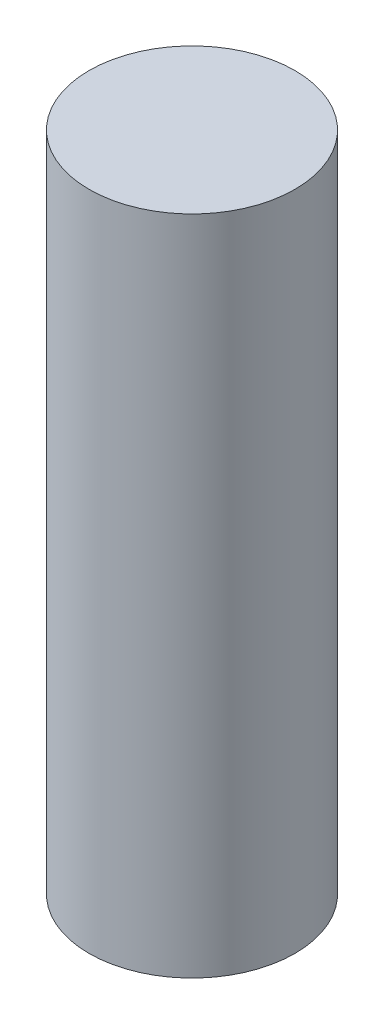
ISO-10303-21;
HEADER;
FILE_DESCRIPTION(('STEP AP214'),'2;1');
FILE_NAME('part.step','',(''),(''),'','','');
FILE_SCHEMA(('AUTOMOTIVE_DESIGN { 1 0 10303 214 1 1 1 1 }'));
ENDSEC;
DATA;
#1=APPLICATION_CONTEXT('core data for automotive mechanical design processes');
#2=APPLICATION_PROTOCOL_DEFINITION('international standard','automotive_design',2000,#1);
#3=PRODUCT_CONTEXT('',#1,'mechanical');
#4=PRODUCT('Part','Part','',(#3));
#5=PRODUCT_RELATED_PRODUCT_CATEGORY('part','',(#4));
#6=PRODUCT_DEFINITION_FORMATION('','',#4);
#7=PRODUCT_DEFINITION_CONTEXT('part definition',#1,'design');
#8=PRODUCT_DEFINITION('design','',#6,#7);
#9=PRODUCT_DEFINITION_SHAPE('','',#8);
#10=(LENGTH_UNIT() NAMED_UNIT(*) SI_UNIT(.MILLI.,.METRE.));
#11=(NAMED_UNIT(*) PLANE_ANGLE_UNIT() SI_UNIT($,.RADIAN.));
#12=(NAMED_UNIT(*) SI_UNIT($,.STERADIAN.) SOLID_ANGLE_UNIT());
#13=UNCERTAINTY_MEASURE_WITH_UNIT(LENGTH_MEASURE(1.E-05),#10,'distance_accuracy_value','');
#14=(GEOMETRIC_REPRESENTATION_CONTEXT(3) GLOBAL_UNCERTAINTY_ASSIGNED_CONTEXT((#13)) GLOBAL_UNIT_ASSIGNED_CONTEXT((#10,
#11,#12)) REPRESENTATION_CONTEXT('',''));
#15=CARTESIAN_POINT('',(0.,0.,0.));
#16=DIRECTION('',(0.,0.,1.));
#17=DIRECTION('',(1.,0.,0.));
#18=AXIS2_PLACEMENT_3D('',#15,#16,#17);
#19=CARTESIAN_POINT('',(0.,45.,0.));
#20=DIRECTION('',(0.,-1.,0.));
#21=DIRECTION('',(0.,0.,-1.));
#22=AXIS2_PLACEMENT_3D('',#19,#20,#21);
#23=CYLINDRICAL_SURFACE('',#22,7.);
#24=CARTESIAN_POINT('',(0.,45.,0.));
#25=DIRECTION('',(0.,1.,0.));
#26=DIRECTION('',(0.,0.,1.));
#27=AXIS2_PLACEMENT_3D('',#24,#25,#26);
#28=CIRCLE('',#27,7.);
#29=CARTESIAN_POINT('',(0.,45.,-7.));
#30=VERTEX_POINT('',#29);
#31=EDGE_CURVE('E10',#30,#30,#28,.T.);
#32=CARTESIAN_POINT('',(0.,0.,0.));
#33=DIRECTION('',(0.,1.,0.));
#34=DIRECTION('',(0.,0.,1.));
#35=AXIS2_PLACEMENT_3D('',#32,#33,#34);
#36=CIRCLE('',#35,7.);
#37=CARTESIAN_POINT('',(0.,0.,-7.));
#38=VERTEX_POINT('',#37);
#39=EDGE_CURVE('E36',#38,#38,#36,.T.);
#40=CARTESIAN_POINT('',(0.,45.,-7.));
#41=CARTESIAN_POINT('',(0.,44.53125,-7.));
#42=CARTESIAN_POINT('',(0.,44.0625,-7.));
#43=CARTESIAN_POINT('',(0.,43.125,-7.));
#44=CARTESIAN_POINT('',(0.,42.65625,-7.));
#45=CARTESIAN_POINT('',(0.,41.71875,-7.));
#46=CARTESIAN_POINT('',(0.,41.25,-7.));
#47=CARTESIAN_POINT('',(0.,40.3125,-7.));
#48=CARTESIAN_POINT('',(0.,39.84375,-7.));
#49=CARTESIAN_POINT('',(0.,38.90625,-7.));
#50=CARTESIAN_POINT('',(0.,38.4375,-7.));
#51=CARTESIAN_POINT('',(0.,37.5,-7.));
#52=CARTESIAN_POINT('',(0.,37.03125,-7.));
#53=CARTESIAN_POINT('',(0.,36.09375,-7.));
#54=CARTESIAN_POINT('',(0.,35.625,-7.));
#55=CARTESIAN_POINT('',(0.,34.6875,-7.));
#56=CARTESIAN_POINT('',(0.,34.21875,-7.));
#57=CARTESIAN_POINT('',(0.,33.28125,-7.));
#58=CARTESIAN_POINT('',(0.,32.8125,-7.));
#59=CARTESIAN_POINT('',(0.,31.875,-7.));
#60=CARTESIAN_POINT('',(0.,31.40625,-7.));
#61=CARTESIAN_POINT('',(0.,30.46875,-7.));
#62=CARTESIAN_POINT('',(0.,30.,-7.));
#63=CARTESIAN_POINT('',(0.,29.0625,-7.));
#64=CARTESIAN_POINT('',(0.,28.59375,-7.));
#65=CARTESIAN_POINT('',(0.,27.65625,-7.));
#66=CARTESIAN_POINT('',(0.,27.1875,-7.));
#67=CARTESIAN_POINT('',(0.,26.25,-7.));
#68=CARTESIAN_POINT('',(0.,25.78125,-7.));
#69=CARTESIAN_POINT('',(0.,24.84375,-7.));
#70=CARTESIAN_POINT('',(0.,24.375,-7.));
#71=CARTESIAN_POINT('',(0.,23.4375,-7.));
#72=CARTESIAN_POINT('',(0.,22.96875,-7.));
#73=CARTESIAN_POINT('',(0.,22.03125,-7.));
#74=CARTESIAN_POINT('',(0.,21.5625,-7.));
#75=CARTESIAN_POINT('',(0.,20.625,-7.));
#76=CARTESIAN_POINT('',(0.,20.15625,-7.));
#77=CARTESIAN_POINT('',(0.,19.21875,-7.));
#78=CARTESIAN_POINT('',(0.,18.75,-7.));
#79=CARTESIAN_POINT('',(0.,17.8125,-7.));
#80=CARTESIAN_POINT('',(0.,17.34375,-7.));
#81=CARTESIAN_POINT('',(0.,16.40625,-7.));
#82=CARTESIAN_POINT('',(0.,15.9375,-7.));
#83=CARTESIAN_POINT('',(0.,15.,-7.));
#84=CARTESIAN_POINT('',(0.,14.53125,-7.));
#85=CARTESIAN_POINT('',(0.,13.59375,-7.));
#86=CARTESIAN_POINT('',(0.,13.125,-7.));
#87=CARTESIAN_POINT('',(0.,12.1875,-7.));
#88=CARTESIAN_POINT('',(0.,11.71875,-7.));
#89=CARTESIAN_POINT('',(0.,10.78125,-7.));
#90=CARTESIAN_POINT('',(0.,10.3125,-7.));
#91=CARTESIAN_POINT('',(0.,9.375,-7.));
#92=CARTESIAN_POINT('',(0.,8.90625,-7.));
#93=CARTESIAN_POINT('',(0.,7.96874999999999,-7.));
#94=CARTESIAN_POINT('',(0.,7.5,-7.));
#95=CARTESIAN_POINT('',(0.,6.5625,-7.));
#96=CARTESIAN_POINT('',(0.,6.09375,-7.));
#97=CARTESIAN_POINT('',(0.,5.15625,-7.));
#98=CARTESIAN_POINT('',(0.,4.68749999999999,-7.));
#99=CARTESIAN_POINT('',(0.,3.74999999999999,-7.));
#100=CARTESIAN_POINT('',(0.,3.28124999999999,-7.));
#101=CARTESIAN_POINT('',(0.,2.34374999999999,-7.));
#102=CARTESIAN_POINT('',(0.,1.87499999999999,-7.));
#103=CARTESIAN_POINT('',(0.,0.937499999999992,-7.));
#104=CARTESIAN_POINT('',(0.,0.468749999999993,-7.));
#105=CARTESIAN_POINT('',(0.,0.,-7.));
#106=B_SPLINE_CURVE_WITH_KNOTS('',3,(#40,#41,#42,#43,#44,#45,#46,#47,#48,#49,#50,#51,#52,#53,
#54,#55,#56,#57,#58,#59,#60,#61,#62,#63,#64,#65,#66,#67,#68,#69,#70,#71,#72,#73,#74,#75,#76,#77,
#78,#79,#80,#81,#82,#83,#84,#85,#86,#87,#88,#89,#90,#91,#92,#93,#94,#95,#96,#97,#98,#99,#100,
#101,#102,#103,#104,#105),.UNSPECIFIED.,.F.,.F.,(4,2,2,2,2,2,2,2,2,2,2,2,2,2,2,2,2,2,2,2,2,2,2,
2,2,2,2,2,2,2,2,2,4),(0.,1.40625,2.8125,4.21875000000001,5.62500000000001,7.03125,8.4375,
9.84375000000001,11.25,12.65625,14.0625,15.46875,16.875,18.28125,19.6875,21.09375,22.5,23.90625,
25.3125,26.71875,28.125,29.53125,30.9375,32.34375,33.75,35.15625,36.5625,37.96875,39.375,
40.78125,42.1875,43.59375,45.),.UNSPECIFIED.);
#107=EDGE_CURVE('BSEAM33',#30,#38,#106,.T.);
#108=ORIENTED_EDGE('',*,*,#31,.F.);
#109=ORIENTED_EDGE('',*,*,#39,.T.);
#110=ORIENTED_EDGE('',*,*,#107,.T.);
#111=ORIENTED_EDGE('',*,*,#107,.F.);
#112=EDGE_LOOP('',(#108,#110,#109,#111));
#113=FACE_BOUND('',#112,.T.);
#114=ADVANCED_FACE('F33',(#113),#23,.T.);
#115=CARTESIAN_POINT('',(0.,45.,0.));
#116=DIRECTION('',(0.,1.,0.));
#117=DIRECTION('',(0.,0.,1.));
#118=AXIS2_PLACEMENT_3D('',#115,#116,#117);
#119=PLANE('',#118);
#120=ORIENTED_EDGE('',*,*,#31,.T.);
#121=EDGE_LOOP('',(#120));
#122=FACE_BOUND('',#121,.T.);
#123=ADVANCED_FACE('F48',(#122),#119,.T.);
#124=CARTESIAN_POINT('',(0.,0.,0.));
#125=DIRECTION('',(0.,1.,0.));
#126=DIRECTION('',(0.,0.,1.));
#127=AXIS2_PLACEMENT_3D('',#124,#125,#126);
#128=PLANE('',#127);
#129=ORIENTED_EDGE('',*,*,#39,.F.);
#130=EDGE_LOOP('',(#129));
#131=FACE_BOUND('',#130,.T.);
#132=ADVANCED_FACE('F46',(#131),#128,.F.);
#133=CLOSED_SHELL('',(#114,#123,#132));
#134=MANIFOLD_SOLID_BREP('B2',#133);
#135=ADVANCED_BREP_SHAPE_REPRESENTATION('',(#18,#134),#14);
#136=SHAPE_DEFINITION_REPRESENTATION(#9,#135);
ENDSEC;
END-ISO-10303-21;
